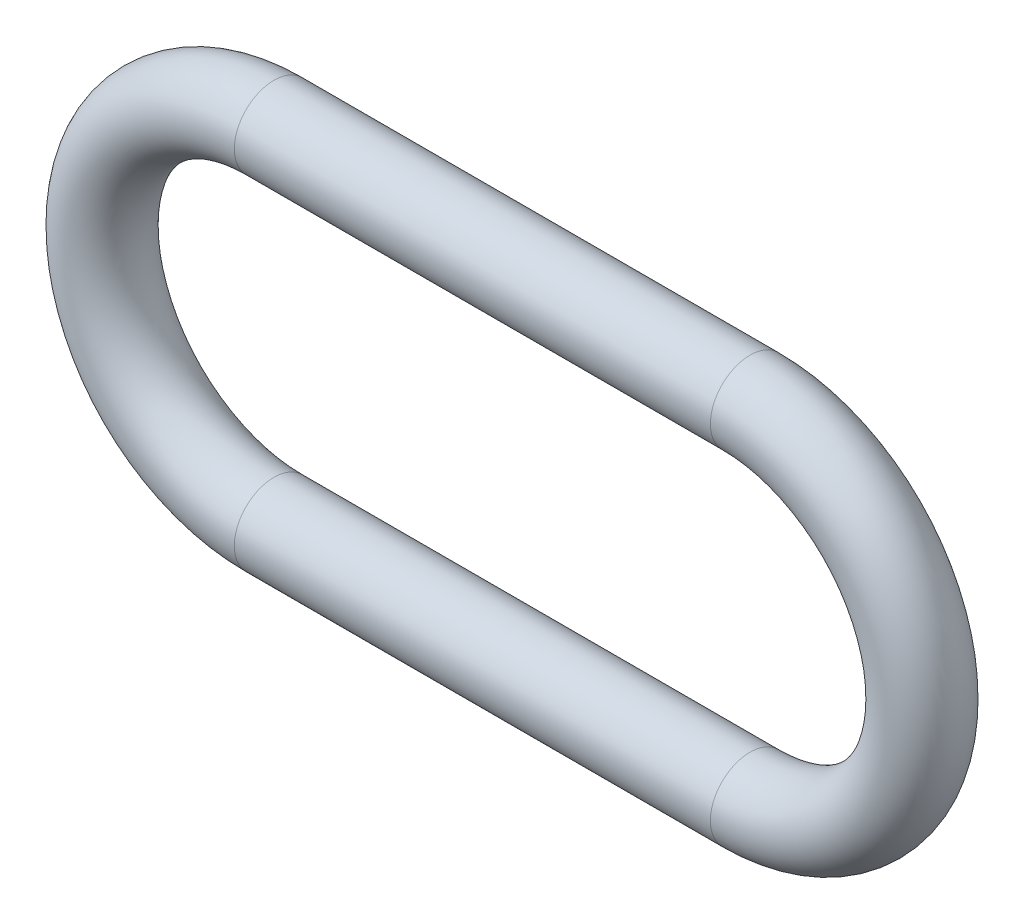
ISO-10303-21;
HEADER;
FILE_DESCRIPTION(('STEP AP214'),'2;1');
FILE_NAME('part.step','',(''),(''),'','','');
FILE_SCHEMA(('AUTOMOTIVE_DESIGN { 1 0 10303 214 1 1 1 1 }'));
ENDSEC;
DATA;
#1=APPLICATION_CONTEXT('core data for automotive mechanical design processes');
#2=APPLICATION_PROTOCOL_DEFINITION('international standard','automotive_design',2000,#1);
#3=PRODUCT_CONTEXT('',#1,'mechanical');
#4=PRODUCT('Part','Part','',(#3));
#5=PRODUCT_RELATED_PRODUCT_CATEGORY('part','',(#4));
#6=PRODUCT_DEFINITION_FORMATION('','',#4);
#7=PRODUCT_DEFINITION_CONTEXT('part definition',#1,'design');
#8=PRODUCT_DEFINITION('design','',#6,#7);
#9=PRODUCT_DEFINITION_SHAPE('','',#8);
#10=(LENGTH_UNIT() NAMED_UNIT(*) SI_UNIT(.MILLI.,.METRE.));
#11=(NAMED_UNIT(*) PLANE_ANGLE_UNIT() SI_UNIT($,.RADIAN.));
#12=(NAMED_UNIT(*) SI_UNIT($,.STERADIAN.) SOLID_ANGLE_UNIT());
#13=UNCERTAINTY_MEASURE_WITH_UNIT(LENGTH_MEASURE(1.E-05),#10,'distance_accuracy_value','');
#14=(GEOMETRIC_REPRESENTATION_CONTEXT(3) GLOBAL_UNCERTAINTY_ASSIGNED_CONTEXT((#13)) GLOBAL_UNIT_ASSIGNED_CONTEXT((#10,
#11,#12)) REPRESENTATION_CONTEXT('',''));
#15=CARTESIAN_POINT('',(0.,0.,0.));
#16=DIRECTION('',(0.,0.,1.));
#17=DIRECTION('',(1.,0.,0.));
#18=AXIS2_PLACEMENT_3D('',#15,#16,#17);
#19=CARTESIAN_POINT('',(0.,0.,0.));
#20=DIRECTION('',(0.,0.,1.));
#21=DIRECTION('',(1.,0.,0.));
#22=AXIS2_PLACEMENT_3D('',#19,#20,#21);
#23=TOROIDAL_SURFACE('',#22,6.5,1.5);
#24=CARTESIAN_POINT('',(0.,6.5,0.));
#25=DIRECTION('',(1.,0.,0.));
#26=DIRECTION('',(0.,0.,-1.));
#27=AXIS2_PLACEMENT_3D('',#24,#25,#26);
#28=CIRCLE('',#27,1.5);
#29=CARTESIAN_POINT('',(0.,8.,0.));
#30=VERTEX_POINT('',#29);
#31=EDGE_CURVE('E45',#30,#30,#28,.T.);
#32=CARTESIAN_POINT('',(0.,-6.5,0.));
#33=DIRECTION('',(-1.,0.,0.));
#34=DIRECTION('',(0.,0.,-1.));
#35=AXIS2_PLACEMENT_3D('',#32,#33,#34);
#36=CIRCLE('',#35,1.5);
#37=CARTESIAN_POINT('',(0.,-8.,0.));
#38=VERTEX_POINT('',#37);
#39=EDGE_CURVE('E41',#38,#38,#36,.T.);
#40=CARTESIAN_POINT('',(0.,0.,0.));
#41=DIRECTION('',(0.,0.,1.));
#42=DIRECTION('',(1.,0.,0.));
#43=AXIS2_PLACEMENT_3D('',#40,#41,#42);
#44=CIRCLE('',#43,8.);
#45=EDGE_CURVE('',#30,#38,#44,.T.);
#46=ORIENTED_EDGE('',*,*,#31,.F.);
#47=ORIENTED_EDGE('',*,*,#39,.T.);
#48=ORIENTED_EDGE('',*,*,#45,.T.);
#49=ORIENTED_EDGE('',*,*,#45,.F.);
#50=EDGE_LOOP('',(#46,#48,#47,#49));
#51=FACE_BOUND('',#50,.T.);
#52=ADVANCED_FACE('F30',(#51),#23,.T.);
#53=CARTESIAN_POINT('',(0.,-6.5,0.));
#54=DIRECTION('',(1.,0.,0.));
#55=DIRECTION('',(0.,1.,0.));
#56=AXIS2_PLACEMENT_3D('',#53,#54,#55);
#57=CYLINDRICAL_SURFACE('',#56,1.5);
#58=CARTESIAN_POINT('',(18.,-6.5,0.));
#59=DIRECTION('',(-1.,0.,0.));
#60=DIRECTION('',(0.,0.,-1.));
#61=AXIS2_PLACEMENT_3D('',#58,#59,#60);
#62=CIRCLE('',#61,1.5);
#63=CARTESIAN_POINT('',(18.,-8.,0.));
#64=VERTEX_POINT('',#63);
#65=EDGE_CURVE('E37',#64,#64,#62,.T.);
#66=ORIENTED_EDGE('',*,*,#65,.T.);
#67=EDGE_LOOP('',(#66));
#68=FACE_BOUND('',#67,.T.);
#69=ORIENTED_EDGE('',*,*,#39,.F.);
#70=EDGE_LOOP('',(#69));
#71=FACE_BOUND('',#70,.T.);
#72=ADVANCED_FACE('F54',(#68,#71),#57,.T.);
#73=CARTESIAN_POINT('',(18.,0.,0.));
#74=DIRECTION('',(0.,0.,1.));
#75=DIRECTION('',(1.,0.,0.));
#76=AXIS2_PLACEMENT_3D('',#73,#74,#75);
#77=TOROIDAL_SURFACE('',#76,6.5,1.5);
#78=CARTESIAN_POINT('',(18.,6.5,0.));
#79=DIRECTION('',(1.,0.,0.));
#80=DIRECTION('',(0.,0.,-1.));
#81=AXIS2_PLACEMENT_3D('',#78,#79,#80);
#82=CIRCLE('',#81,1.5);
#83=CARTESIAN_POINT('',(18.,8.,0.));
#84=VERTEX_POINT('',#83);
#85=EDGE_CURVE('E10',#84,#84,#82,.T.);
#86=CARTESIAN_POINT('',(18.,0.,0.));
#87=DIRECTION('',(0.,0.,1.));
#88=DIRECTION('',(1.,0.,0.));
#89=AXIS2_PLACEMENT_3D('',#86,#87,#88);
#90=CIRCLE('',#89,8.);
#91=EDGE_CURVE('',#64,#84,#90,.T.);
#92=ORIENTED_EDGE('',*,*,#65,.F.);
#93=ORIENTED_EDGE('',*,*,#85,.T.);
#94=ORIENTED_EDGE('',*,*,#91,.T.);
#95=ORIENTED_EDGE('',*,*,#91,.F.);
#96=EDGE_LOOP('',(#92,#94,#93,#95));
#97=FACE_BOUND('',#96,.T.);
#98=ADVANCED_FACE('F60',(#97),#77,.T.);
#99=CARTESIAN_POINT('',(18.,6.5,0.));
#100=DIRECTION('',(-1.,0.,0.));
#101=DIRECTION('',(0.,-1.,0.));
#102=AXIS2_PLACEMENT_3D('',#99,#100,#101);
#103=CYLINDRICAL_SURFACE('',#102,1.5);
#104=ORIENTED_EDGE('',*,*,#31,.T.);
#105=EDGE_LOOP('',(#104));
#106=FACE_BOUND('',#105,.T.);
#107=ORIENTED_EDGE('',*,*,#85,.F.);
#108=EDGE_LOOP('',(#107));
#109=FACE_BOUND('',#108,.T.);
#110=ADVANCED_FACE('F32',(#106,#109),#103,.T.);
#111=CLOSED_SHELL('',(#52,#72,#98,#110));
#112=MANIFOLD_SOLID_BREP('B2',#111);
#113=ADVANCED_BREP_SHAPE_REPRESENTATION('',(#18,#112),#14);
#114=SHAPE_DEFINITION_REPRESENTATION(#9,#113);
ENDSEC;
END-ISO-10303-21;
